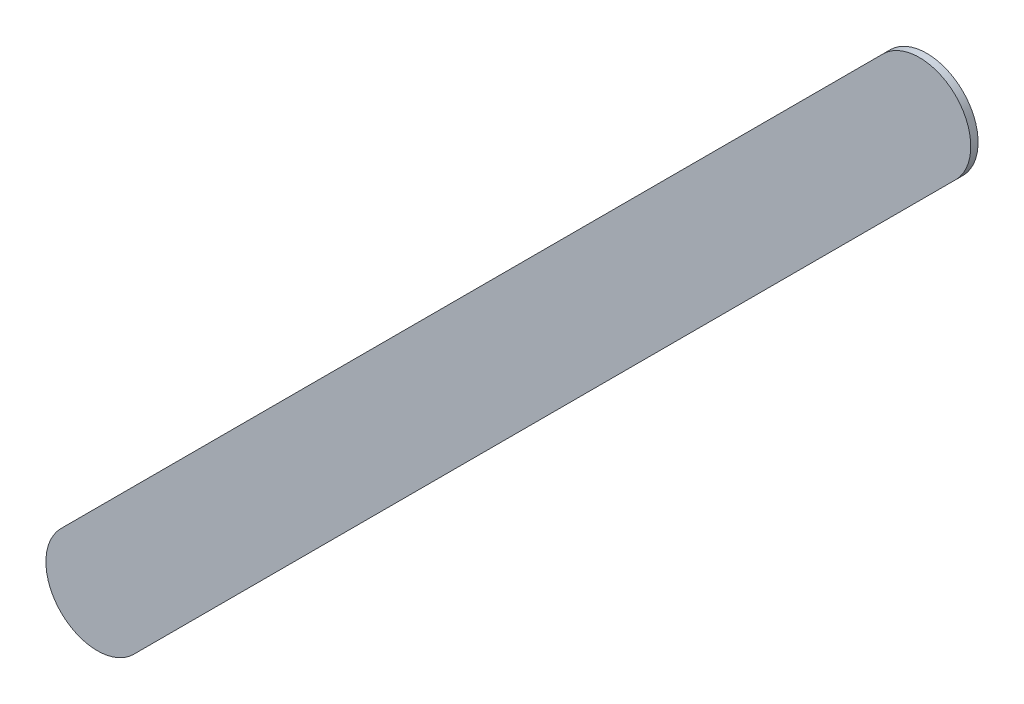
ISO-10303-21;
HEADER;
FILE_DESCRIPTION(('STEP AP214'),'2;1');
FILE_NAME('part.step','',(''),(''),'','','');
FILE_SCHEMA(('AUTOMOTIVE_DESIGN { 1 0 10303 214 1 1 1 1 }'));
ENDSEC;
DATA;
#1=APPLICATION_CONTEXT('core data for automotive mechanical design processes');
#2=APPLICATION_PROTOCOL_DEFINITION('international standard','automotive_design',2000,#1);
#3=PRODUCT_CONTEXT('',#1,'mechanical');
#4=PRODUCT('Part','Part','',(#3));
#5=PRODUCT_RELATED_PRODUCT_CATEGORY('part','',(#4));
#6=PRODUCT_DEFINITION_FORMATION('','',#4);
#7=PRODUCT_DEFINITION_CONTEXT('part definition',#1,'design');
#8=PRODUCT_DEFINITION('design','',#6,#7);
#9=PRODUCT_DEFINITION_SHAPE('','',#8);
#10=(LENGTH_UNIT() NAMED_UNIT(*) SI_UNIT(.MILLI.,.METRE.));
#11=(NAMED_UNIT(*) PLANE_ANGLE_UNIT() SI_UNIT($,.RADIAN.));
#12=(NAMED_UNIT(*) SI_UNIT($,.STERADIAN.) SOLID_ANGLE_UNIT());
#13=UNCERTAINTY_MEASURE_WITH_UNIT(LENGTH_MEASURE(1.E-05),#10,'distance_accuracy_value','');
#14=(GEOMETRIC_REPRESENTATION_CONTEXT(3) GLOBAL_UNCERTAINTY_ASSIGNED_CONTEXT((#13)) GLOBAL_UNIT_ASSIGNED_CONTEXT((#10,
#11,#12)) REPRESENTATION_CONTEXT('',''));
#15=CARTESIAN_POINT('',(0.,0.,0.));
#16=DIRECTION('',(0.,0.,1.));
#17=DIRECTION('',(1.,0.,0.));
#18=AXIS2_PLACEMENT_3D('',#15,#16,#17);
#19=CARTESIAN_POINT('',(58.57677642,89.82322396,0.));
#20=DIRECTION('',(-0.707106781186546,0.707106781186549,0.));
#21=DIRECTION('',(0.707106781186549,0.707106781186546,0.));
#22=AXIS2_PLACEMENT_3D('',#19,#20,#21);
#23=PLANE('',#22);
#24=DIRECTION('',(0.707106781186549,0.707106781186546,0.));
#25=VECTOR('',#24,1.);
#26=CARTESIAN_POINT('',(58.57677642,89.82322396,0.03556));
#27=LINE('',#26,#25);
#28=CARTESIAN_POINT('',(58.57677642,89.82322396,0.03556));
#29=VERTEX_POINT('',#28);
#30=CARTESIAN_POINT('',(62.57677604,93.82322358,0.03556));
#31=VERTEX_POINT('',#30);
#32=EDGE_CURVE('E11',#29,#31,#27,.T.);
#33=ORIENTED_EDGE('',*,*,#32,.F.);
#34=DIRECTION('',(0.,0.,1.));
#35=VECTOR('',#34,1.);
#36=CARTESIAN_POINT('',(58.57677642,89.82322396,0.));
#37=LINE('',#36,#35);
#38=CARTESIAN_POINT('',(58.57677642,89.82322396,0.));
#39=VERTEX_POINT('',#38);
#40=EDGE_CURVE('E24',#39,#29,#37,.T.);
#41=ORIENTED_EDGE('',*,*,#40,.F.);
#42=DIRECTION('',(0.707106781186549,0.707106781186546,0.));
#43=VECTOR('',#42,1.);
#44=CARTESIAN_POINT('',(58.57677642,89.82322396,0.));
#45=LINE('',#44,#43);
#46=CARTESIAN_POINT('',(62.57677604,93.82322358,0.));
#47=VERTEX_POINT('',#46);
#48=EDGE_CURVE('E75',#39,#47,#45,.T.);
#49=ORIENTED_EDGE('',*,*,#48,.T.);
#50=DIRECTION('',(0.,0.,1.));
#51=VECTOR('',#50,1.);
#52=CARTESIAN_POINT('',(62.57677604,93.82322358,0.));
#53=LINE('',#52,#51);
#54=EDGE_CURVE('E37',#47,#31,#53,.T.);
#55=ORIENTED_EDGE('',*,*,#54,.T.);
#56=EDGE_LOOP('',(#33,#41,#49,#55));
#57=FACE_BOUND('',#56,.T.);
#58=ADVANCED_FACE('F17',(#57),#23,.F.);
#59=CARTESIAN_POINT('',(62.39999966,93.99999996,0.));
#60=DIRECTION('',(0.,0.,-1.));
#61=DIRECTION('',(0.707106781186533,-0.707106781186562,0.));
#62=AXIS2_PLACEMENT_3D('',#59,#60,#61);
#63=CYLINDRICAL_SURFACE('',#62,0.24999955410322);
#64=CARTESIAN_POINT('',(62.39999966,93.99999996,0.03556));
#65=DIRECTION('',(0.,0.,1.));
#66=DIRECTION('',(0.707106781186533,-0.707106781186562,0.));
#67=AXIS2_PLACEMENT_3D('',#64,#65,#66);
#68=CIRCLE('',#67,0.24999955410322);
#69=CARTESIAN_POINT('',(62.22322328,94.17677634,0.03556));
#70=VERTEX_POINT('',#69);
#71=EDGE_CURVE('E83',#31,#70,#68,.T.);
#72=ORIENTED_EDGE('',*,*,#71,.F.);
#73=ORIENTED_EDGE('',*,*,#54,.F.);
#74=CARTESIAN_POINT('',(62.39999966,93.99999996,0.));
#75=DIRECTION('',(0.,0.,1.));
#76=DIRECTION('',(0.707106781186533,-0.707106781186562,0.));
#77=AXIS2_PLACEMENT_3D('',#74,#75,#76);
#78=CIRCLE('',#77,0.24999955410322);
#79=CARTESIAN_POINT('',(62.22322328,94.17677634,0.));
#80=VERTEX_POINT('',#79);
#81=EDGE_CURVE('E81',#47,#80,#78,.T.);
#82=ORIENTED_EDGE('',*,*,#81,.T.);
#83=DIRECTION('',(0.,0.,1.));
#84=VECTOR('',#83,1.);
#85=CARTESIAN_POINT('',(62.22322328,94.17677634,0.));
#86=LINE('',#85,#84);
#87=EDGE_CURVE('E67',#80,#70,#86,.T.);
#88=ORIENTED_EDGE('',*,*,#87,.T.);
#89=EDGE_LOOP('',(#72,#73,#82,#88));
#90=FACE_BOUND('',#89,.T.);
#91=ADVANCED_FACE('F89',(#90),#63,.T.);
#92=CARTESIAN_POINT('',(62.22322328,94.17677634,0.));
#93=DIRECTION('',(0.707106781186546,-0.70710678118655,0.));
#94=DIRECTION('',(-0.70710678118655,-0.707106781186546,0.));
#95=AXIS2_PLACEMENT_3D('',#92,#93,#94);
#96=PLANE('',#95);
#97=DIRECTION('',(-0.70710678118655,-0.707106781186546,0.));
#98=VECTOR('',#97,1.);
#99=CARTESIAN_POINT('',(62.22322328,94.17677634,0.03556));
#100=LINE('',#99,#98);
#101=CARTESIAN_POINT('',(58.22322366,90.17677672,0.03556));
#102=VERTEX_POINT('',#101);
#103=EDGE_CURVE('E71',#70,#102,#100,.T.);
#104=ORIENTED_EDGE('',*,*,#103,.F.);
#105=ORIENTED_EDGE('',*,*,#87,.F.);
#106=DIRECTION('',(-0.70710678118655,-0.707106781186546,0.));
#107=VECTOR('',#106,1.);
#108=CARTESIAN_POINT('',(62.22322328,94.17677634,0.));
#109=LINE('',#108,#107);
#110=CARTESIAN_POINT('',(58.22322366,90.17677672,0.));
#111=VERTEX_POINT('',#110);
#112=EDGE_CURVE('E63',#80,#111,#109,.T.);
#113=ORIENTED_EDGE('',*,*,#112,.T.);
#114=DIRECTION('',(0.,0.,1.));
#115=VECTOR('',#114,1.);
#116=CARTESIAN_POINT('',(58.22322366,90.17677672,0.));
#117=LINE('',#116,#115);
#118=EDGE_CURVE('E53',#111,#102,#117,.T.);
#119=ORIENTED_EDGE('',*,*,#118,.T.);
#120=EDGE_LOOP('',(#104,#105,#113,#119));
#121=FACE_BOUND('',#120,.T.);
#122=ADVANCED_FACE('F66',(#121),#96,.F.);
#123=CARTESIAN_POINT('',(58.40000004,90.00000034,0.));
#124=DIRECTION('',(0.,0.,-1.));
#125=DIRECTION('',(-0.707106781186533,0.707106781186562,0.));
#126=AXIS2_PLACEMENT_3D('',#123,#124,#125);
#127=CYLINDRICAL_SURFACE('',#126,0.249999554103225);
#128=CARTESIAN_POINT('',(58.40000004,90.00000034,0.03556));
#129=DIRECTION('',(0.,0.,1.));
#130=DIRECTION('',(-0.707106781186533,0.707106781186562,0.));
#131=AXIS2_PLACEMENT_3D('',#128,#129,#130);
#132=CIRCLE('',#131,0.249999554103225);
#133=EDGE_CURVE('E59',#102,#29,#132,.T.);
#134=ORIENTED_EDGE('',*,*,#133,.F.);
#135=ORIENTED_EDGE('',*,*,#118,.F.);
#136=CARTESIAN_POINT('',(58.40000004,90.00000034,0.));
#137=DIRECTION('',(0.,0.,1.));
#138=DIRECTION('',(-0.707106781186533,0.707106781186562,0.));
#139=AXIS2_PLACEMENT_3D('',#136,#137,#138);
#140=CIRCLE('',#139,0.249999554103225);
#141=EDGE_CURVE('E57',#111,#39,#140,.T.);
#142=ORIENTED_EDGE('',*,*,#141,.T.);
#143=ORIENTED_EDGE('',*,*,#40,.T.);
#144=EDGE_LOOP('',(#134,#135,#142,#143));
#145=FACE_BOUND('',#144,.T.);
#146=ADVANCED_FACE('F55',(#145),#127,.T.);
#147=CARTESIAN_POINT('',(58.57677642,89.82322396,0.));
#148=DIRECTION('',(0.,0.,-1.));
#149=DIRECTION('',(-1.,0.,0.));
#150=AXIS2_PLACEMENT_3D('',#147,#148,#149);
#151=PLANE('',#150);
#152=ORIENTED_EDGE('',*,*,#141,.F.);
#153=ORIENTED_EDGE('',*,*,#112,.F.);
#154=ORIENTED_EDGE('',*,*,#81,.F.);
#155=ORIENTED_EDGE('',*,*,#48,.F.);
#156=EDGE_LOOP('',(#152,#153,#154,#155));
#157=FACE_BOUND('',#156,.T.);
#158=ADVANCED_FACE('F74',(#157),#151,.T.);
#159=CARTESIAN_POINT('',(58.57677642,89.82322396,0.03556));
#160=DIRECTION('',(0.,0.,-1.));
#161=DIRECTION('',(-1.,0.,0.));
#162=AXIS2_PLACEMENT_3D('',#159,#160,#161);
#163=PLANE('',#162);
#164=ORIENTED_EDGE('',*,*,#32,.T.);
#165=ORIENTED_EDGE('',*,*,#71,.T.);
#166=ORIENTED_EDGE('',*,*,#103,.T.);
#167=ORIENTED_EDGE('',*,*,#133,.T.);
#168=EDGE_LOOP('',(#164,#165,#166,#167));
#169=FACE_BOUND('',#168,.T.);
#170=ADVANCED_FACE('F91',(#169),#163,.F.);
#171=CLOSED_SHELL('',(#58,#91,#122,#146,#158,#170));
#172=MANIFOLD_SOLID_BREP('B1',#171);
#173=ADVANCED_BREP_SHAPE_REPRESENTATION('',(#18,#172),#14);
#174=SHAPE_DEFINITION_REPRESENTATION(#9,#173);
ENDSEC;
END-ISO-10303-21;
